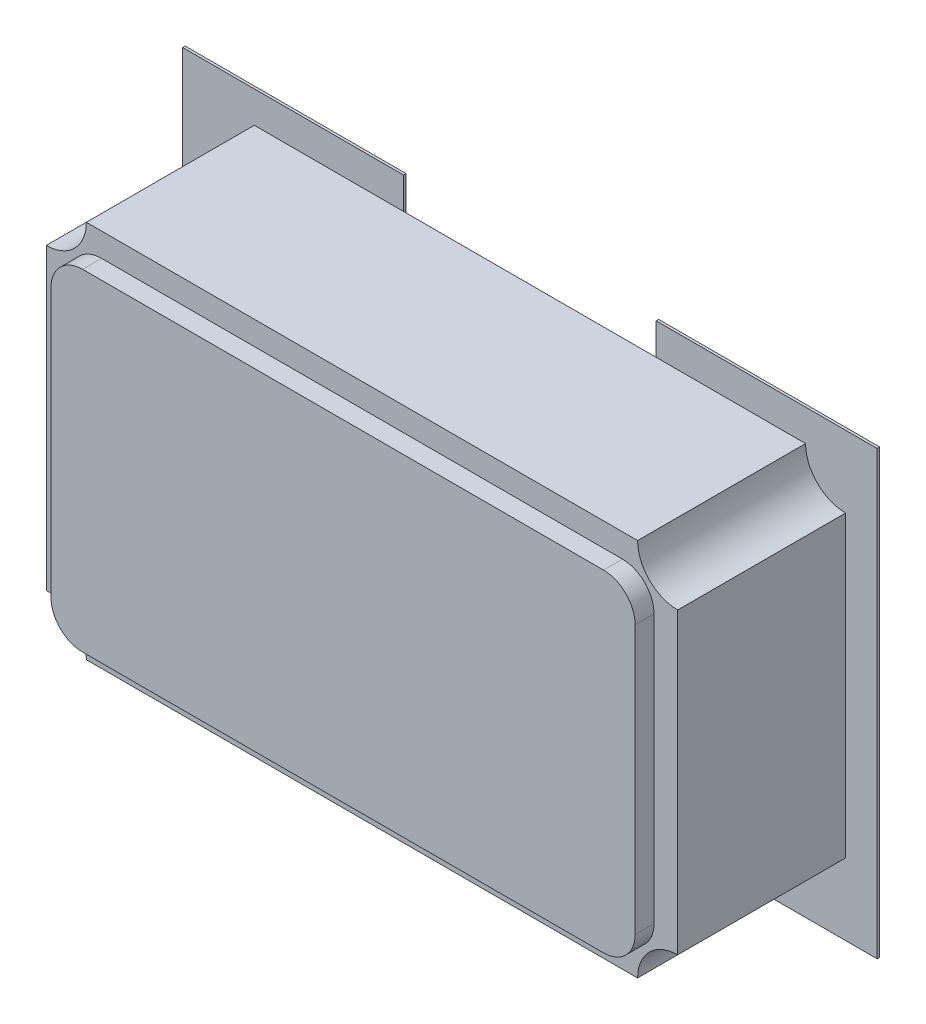
ISO-10303-21;
HEADER;
FILE_DESCRIPTION(('STEP AP214'),'2;1');
FILE_NAME('part.step','',(''),(''),'','','');
FILE_SCHEMA(('AUTOMOTIVE_DESIGN { 1 0 10303 214 1 1 1 1 }'));
ENDSEC;
DATA;
#1=APPLICATION_CONTEXT('core data for automotive mechanical design processes');
#2=APPLICATION_PROTOCOL_DEFINITION('international standard','automotive_design',2000,#1);
#3=PRODUCT_CONTEXT('',#1,'mechanical');
#4=PRODUCT('Part','Part','',(#3));
#5=PRODUCT_RELATED_PRODUCT_CATEGORY('part','',(#4));
#6=PRODUCT_DEFINITION_FORMATION('','',#4);
#7=PRODUCT_DEFINITION_CONTEXT('part definition',#1,'design');
#8=PRODUCT_DEFINITION('design','',#6,#7);
#9=PRODUCT_DEFINITION_SHAPE('','',#8);
#10=(LENGTH_UNIT() NAMED_UNIT(*) SI_UNIT(.MILLI.,.METRE.));
#11=(NAMED_UNIT(*) PLANE_ANGLE_UNIT() SI_UNIT($,.RADIAN.));
#12=(NAMED_UNIT(*) SI_UNIT($,.STERADIAN.) SOLID_ANGLE_UNIT());
#13=UNCERTAINTY_MEASURE_WITH_UNIT(LENGTH_MEASURE(1.E-05),#10,'distance_accuracy_value','');
#14=(GEOMETRIC_REPRESENTATION_CONTEXT(3) GLOBAL_UNCERTAINTY_ASSIGNED_CONTEXT((#13)) GLOBAL_UNIT_ASSIGNED_CONTEXT((#10,
#11,#12)) REPRESENTATION_CONTEXT('',''));
#15=CARTESIAN_POINT('',(0.,0.,0.));
#16=DIRECTION('',(0.,0.,1.));
#17=DIRECTION('',(1.,0.,0.));
#18=AXIS2_PLACEMENT_3D('',#15,#16,#17);
#19=CARTESIAN_POINT('',(0.,0.,0.0762));
#20=DIRECTION('',(0.,0.,1.));
#21=DIRECTION('',(1.,0.,0.));
#22=AXIS2_PLACEMENT_3D('',#19,#20,#21);
#23=PLANE('',#22);
#24=DIRECTION('',(0.,1.,0.));
#25=VECTOR('',#24,1.);
#26=CARTESIAN_POINT('',(1.09999999999992,0.699999999999994,0.0762));
#27=LINE('',#26,#25);
#28=CARTESIAN_POINT('',(1.09999999999992,-0.699999999999994,0.0762));
#29=VERTEX_POINT('',#28);
#30=CARTESIAN_POINT('',(1.09999999999992,0.699999999999994,0.0762));
#31=VERTEX_POINT('',#30);
#32=EDGE_CURVE('E172',#29,#31,#27,.T.);
#33=ORIENTED_EDGE('',*,*,#32,.F.);
#34=DIRECTION('',(1.,0.,0.));
#35=VECTOR('',#34,1.);
#36=CARTESIAN_POINT('',(1.09999999999992,-0.699999999999994,0.0762));
#37=LINE('',#36,#35);
#38=CARTESIAN_POINT('',(0.399999999999924,-0.699999999999994,0.0762));
#39=VERTEX_POINT('',#38);
#40=EDGE_CURVE('E194',#39,#29,#37,.T.);
#41=ORIENTED_EDGE('',*,*,#40,.F.);
#42=DIRECTION('',(0.,1.,0.));
#43=VECTOR('',#42,1.);
#44=CARTESIAN_POINT('',(0.399999999999924,-0.699999999999994,0.0762));
#45=LINE('',#44,#43);
#46=CARTESIAN_POINT('',(0.399999999999924,0.699999999999994,0.0762));
#47=VERTEX_POINT('',#46);
#48=EDGE_CURVE('E175',#47,#39,#45,.F.);
#49=ORIENTED_EDGE('',*,*,#48,.F.);
#50=DIRECTION('',(1.,0.,0.));
#51=VECTOR('',#50,1.);
#52=CARTESIAN_POINT('',(0.399999999999924,0.699999999999994,0.0762));
#53=LINE('',#52,#51);
#54=EDGE_CURVE('E169',#31,#47,#53,.F.);
#55=ORIENTED_EDGE('',*,*,#54,.F.);
#56=EDGE_LOOP('',(#33,#41,#49,#55));
#57=FACE_BOUND('',#56,.T.);
#58=ADVANCED_FACE('F17',(#57),#23,.F.);
#59=CARTESIAN_POINT('',(0.,0.,0.0762));
#60=DIRECTION('',(0.,0.,1.));
#61=DIRECTION('',(1.,0.,0.));
#62=AXIS2_PLACEMENT_3D('',#59,#60,#61);
#63=PLANE('',#62);
#64=DIRECTION('',(0.,1.,0.));
#65=VECTOR('',#64,1.);
#66=CARTESIAN_POINT('',(-1.09999999999992,-0.699999999999994,0.0762));
#67=LINE('',#66,#65);
#68=CARTESIAN_POINT('',(-1.09999999999992,0.699999999999994,0.0762));
#69=VERTEX_POINT('',#68);
#70=CARTESIAN_POINT('',(-1.09999999999992,-0.699999999999994,0.0762));
#71=VERTEX_POINT('',#70);
#72=EDGE_CURVE('E331',#69,#71,#67,.F.);
#73=ORIENTED_EDGE('',*,*,#72,.F.);
#74=DIRECTION('',(1.,0.,0.));
#75=VECTOR('',#74,1.);
#76=CARTESIAN_POINT('',(0.,0.699999999999994,0.0762));
#77=LINE('',#76,#75);
#78=CARTESIAN_POINT('',(-0.399999999999924,0.699999999999994,0.0762));
#79=VERTEX_POINT('',#78);
#80=EDGE_CURVE('E180',#79,#69,#77,.F.);
#81=ORIENTED_EDGE('',*,*,#80,.F.);
#82=DIRECTION('',(0.,1.,0.));
#83=VECTOR('',#82,1.);
#84=CARTESIAN_POINT('',(-0.399999999999924,0.699999999999994,0.0762));
#85=LINE('',#84,#83);
#86=CARTESIAN_POINT('',(-0.399999999999924,-0.699999999999994,0.0762));
#87=VERTEX_POINT('',#86);
#88=EDGE_CURVE('E341',#87,#79,#85,.T.);
#89=ORIENTED_EDGE('',*,*,#88,.F.);
#90=DIRECTION('',(1.,0.,0.));
#91=VECTOR('',#90,1.);
#92=CARTESIAN_POINT('',(-0.399999999999924,-0.699999999999994,0.0762));
#93=LINE('',#92,#91);
#94=EDGE_CURVE('E337',#71,#87,#93,.T.);
#95=ORIENTED_EDGE('',*,*,#94,.F.);
#96=EDGE_LOOP('',(#73,#81,#89,#95));
#97=FACE_BOUND('',#96,.T.);
#98=ADVANCED_FACE('F761',(#97),#63,.F.);
#99=CARTESIAN_POINT('',(0.399999999999924,0.699999999999994,0.0762));
#100=DIRECTION('',(0.,1.,0.));
#101=DIRECTION('',(0.,0.,1.));
#102=AXIS2_PLACEMENT_3D('',#99,#100,#101);
#103=PLANE('',#102);
#104=DIRECTION('',(0.,0.,-1.));
#105=VECTOR('',#104,1.);
#106=CARTESIAN_POINT('',(1.09999999999992,0.699999999999994,0.0762));
#107=LINE('',#106,#105);
#108=CARTESIAN_POINT('',(1.09999999999992,0.699999999999994,0.0841999999999934));
#109=VERTEX_POINT('',#108);
#110=EDGE_CURVE('E179',#31,#109,#107,.F.);
#111=ORIENTED_EDGE('',*,*,#110,.F.);
#112=ORIENTED_EDGE('',*,*,#54,.T.);
#113=DIRECTION('',(0.,0.,1.));
#114=VECTOR('',#113,1.);
#115=CARTESIAN_POINT('',(0.399999999999924,0.699999999999994,0.0762));
#116=LINE('',#115,#114);
#117=CARTESIAN_POINT('',(0.399999999999924,0.699999999999994,0.0841999999999934));
#118=VERTEX_POINT('',#117);
#119=EDGE_CURVE('E347',#118,#47,#116,.F.);
#120=ORIENTED_EDGE('',*,*,#119,.F.);
#121=DIRECTION('',(-1.,0.,0.));
#122=VECTOR('',#121,1.);
#123=CARTESIAN_POINT('',(0.,0.699999999999994,0.0841999999999934));
#124=LINE('',#123,#122);
#125=EDGE_CURVE('E185',#118,#109,#124,.F.);
#126=ORIENTED_EDGE('',*,*,#125,.T.);
#127=EDGE_LOOP('',(#111,#112,#120,#126));
#128=FACE_BOUND('',#127,.T.);
#129=ADVANCED_FACE('F183',(#128),#103,.T.);
#130=CARTESIAN_POINT('',(1.09999999999992,0.699999999999994,0.0762));
#131=DIRECTION('',(1.,0.,0.));
#132=DIRECTION('',(0.,0.,-1.));
#133=AXIS2_PLACEMENT_3D('',#130,#131,#132);
#134=PLANE('',#133);
#135=DIRECTION('',(0.,0.,-1.));
#136=VECTOR('',#135,1.);
#137=CARTESIAN_POINT('',(1.09999999999992,-0.699999999999994,0.0762));
#138=LINE('',#137,#136);
#139=CARTESIAN_POINT('',(1.09999999999992,-0.699999999999994,0.0841999999999934));
#140=VERTEX_POINT('',#139);
#141=EDGE_CURVE('E191',#29,#140,#138,.F.);
#142=ORIENTED_EDGE('',*,*,#141,.F.);
#143=ORIENTED_EDGE('',*,*,#32,.T.);
#144=ORIENTED_EDGE('',*,*,#110,.T.);
#145=DIRECTION('',(0.,1.,0.));
#146=VECTOR('',#145,1.);
#147=CARTESIAN_POINT('',(1.09999999999992,0.,0.0841999999999934));
#148=LINE('',#147,#146);
#149=EDGE_CURVE('E360',#109,#140,#148,.F.);
#150=ORIENTED_EDGE('',*,*,#149,.T.);
#151=EDGE_LOOP('',(#142,#143,#144,#150));
#152=FACE_BOUND('',#151,.T.);
#153=ADVANCED_FACE('F189',(#152),#134,.T.);
#154=CARTESIAN_POINT('',(1.09999999999992,-0.699999999999994,0.0762));
#155=DIRECTION('',(0.,-1.,0.));
#156=DIRECTION('',(0.,0.,-1.));
#157=AXIS2_PLACEMENT_3D('',#154,#155,#156);
#158=PLANE('',#157);
#159=DIRECTION('',(0.,0.,1.));
#160=VECTOR('',#159,1.);
#161=CARTESIAN_POINT('',(0.399999999999924,-0.699999999999994,0.0762));
#162=LINE('',#161,#160);
#163=CARTESIAN_POINT('',(0.399999999999924,-0.699999999999994,0.0841999999999934));
#164=VERTEX_POINT('',#163);
#165=EDGE_CURVE('E353',#39,#164,#162,.T.);
#166=ORIENTED_EDGE('',*,*,#165,.F.);
#167=ORIENTED_EDGE('',*,*,#40,.T.);
#168=ORIENTED_EDGE('',*,*,#141,.T.);
#169=DIRECTION('',(-1.,0.,0.));
#170=VECTOR('',#169,1.);
#171=CARTESIAN_POINT('',(0.,-0.699999999999994,0.0841999999999934));
#172=LINE('',#171,#170);
#173=EDGE_CURVE('E320',#140,#164,#172,.T.);
#174=ORIENTED_EDGE('',*,*,#173,.T.);
#175=EDGE_LOOP('',(#166,#167,#168,#174));
#176=FACE_BOUND('',#175,.T.);
#177=ADVANCED_FACE('F431',(#176),#158,.T.);
#178=CARTESIAN_POINT('',(-0.399999999999924,0.699999999999994,0.0762));
#179=DIRECTION('',(1.,0.,0.));
#180=DIRECTION('',(0.,0.,-1.));
#181=AXIS2_PLACEMENT_3D('',#178,#179,#180);
#182=PLANE('',#181);
#183=DIRECTION('',(0.,1.,0.));
#184=VECTOR('',#183,1.);
#185=CARTESIAN_POINT('',(-0.399999999999924,0.,0.0841999999999934));
#186=LINE('',#185,#184);
#187=CARTESIAN_POINT('',(-0.399999999999924,-0.599999999999886,0.0841999999999934));
#188=VERTEX_POINT('',#187);
#189=CARTESIAN_POINT('',(-0.399999999999924,0.599999999999886,0.0841999999999934));
#190=VERTEX_POINT('',#189);
#191=EDGE_CURVE('E284',#188,#190,#186,.T.);
#192=ORIENTED_EDGE('',*,*,#191,.F.);
#193=DIRECTION('',(0.,1.,0.));
#194=VECTOR('',#193,1.);
#195=CARTESIAN_POINT('',(-0.399999999999924,0.699999999999994,0.0841999999999934));
#196=LINE('',#195,#194);
#197=CARTESIAN_POINT('',(-0.399999999999924,-0.699999999999994,0.0841999999999934));
#198=VERTEX_POINT('',#197);
#199=EDGE_CURVE('E344',#188,#198,#196,.F.);
#200=ORIENTED_EDGE('',*,*,#199,.T.);
#201=DIRECTION('',(0.,0.,-1.));
#202=VECTOR('',#201,1.);
#203=CARTESIAN_POINT('',(-0.399999999999924,-0.699999999999994,0.0762));
#204=LINE('',#203,#202);
#205=EDGE_CURVE('E340',#87,#198,#204,.F.);
#206=ORIENTED_EDGE('',*,*,#205,.F.);
#207=ORIENTED_EDGE('',*,*,#88,.T.);
#208=DIRECTION('',(0.,0.,1.));
#209=VECTOR('',#208,1.);
#210=CARTESIAN_POINT('',(-0.399999999999924,0.699999999999994,0.0762));
#211=LINE('',#210,#209);
#212=CARTESIAN_POINT('',(-0.399999999999924,0.699999999999994,0.0841999999999934));
#213=VERTEX_POINT('',#212);
#214=EDGE_CURVE('E330',#213,#79,#211,.F.);
#215=ORIENTED_EDGE('',*,*,#214,.F.);
#216=DIRECTION('',(0.,1.,0.));
#217=VECTOR('',#216,1.);
#218=CARTESIAN_POINT('',(-0.399999999999924,0.699999999999994,0.0841999999999934));
#219=LINE('',#218,#217);
#220=EDGE_CURVE('E141',#213,#190,#219,.F.);
#221=ORIENTED_EDGE('',*,*,#220,.T.);
#222=EDGE_LOOP('',(#192,#200,#206,#207,#215,#221));
#223=FACE_BOUND('',#222,.T.);
#224=ADVANCED_FACE('F446',(#223),#182,.T.);
#225=CARTESIAN_POINT('',(0.399999999999924,-0.699999999999994,0.0762));
#226=DIRECTION('',(-1.,0.,0.));
#227=DIRECTION('',(0.,0.,1.));
#228=AXIS2_PLACEMENT_3D('',#225,#226,#227);
#229=PLANE('',#228);
#230=DIRECTION('',(0.,1.,0.));
#231=VECTOR('',#230,1.);
#232=CARTESIAN_POINT('',(0.399999999999924,0.,0.0841999999999934));
#233=LINE('',#232,#231);
#234=CARTESIAN_POINT('',(0.399999999999924,0.599999999999886,0.0841999999999934));
#235=VERTEX_POINT('',#234);
#236=CARTESIAN_POINT('',(0.399999999999924,-0.599999999999886,0.0841999999999934));
#237=VERTEX_POINT('',#236);
#238=EDGE_CURVE('E287',#235,#237,#233,.F.);
#239=ORIENTED_EDGE('',*,*,#238,.F.);
#240=DIRECTION('',(0.,1.,0.));
#241=VECTOR('',#240,1.);
#242=CARTESIAN_POINT('',(0.399999999999924,0.,0.0841999999999934));
#243=LINE('',#242,#241);
#244=EDGE_CURVE('E301',#235,#118,#243,.T.);
#245=ORIENTED_EDGE('',*,*,#244,.T.);
#246=ORIENTED_EDGE('',*,*,#119,.T.);
#247=ORIENTED_EDGE('',*,*,#48,.T.);
#248=ORIENTED_EDGE('',*,*,#165,.T.);
#249=DIRECTION('',(0.,1.,0.));
#250=VECTOR('',#249,1.);
#251=CARTESIAN_POINT('',(0.399999999999924,0.,0.0841999999999934));
#252=LINE('',#251,#250);
#253=EDGE_CURVE('E288',#164,#237,#252,.T.);
#254=ORIENTED_EDGE('',*,*,#253,.T.);
#255=EDGE_LOOP('',(#239,#245,#246,#247,#248,#254));
#256=FACE_BOUND('',#255,.T.);
#257=ADVANCED_FACE('F421',(#256),#229,.T.);
#258=CARTESIAN_POINT('',(-0.399999999999924,-0.699999999999994,0.0762));
#259=DIRECTION('',(0.,-1.,0.));
#260=DIRECTION('',(0.,0.,-1.));
#261=AXIS2_PLACEMENT_3D('',#258,#259,#260);
#262=PLANE('',#261);
#263=DIRECTION('',(0.,0.,1.));
#264=VECTOR('',#263,1.);
#265=CARTESIAN_POINT('',(-1.09999999999992,-0.699999999999994,0.0762));
#266=LINE('',#265,#264);
#267=CARTESIAN_POINT('',(-1.09999999999992,-0.699999999999994,0.0841999999999934));
#268=VERTEX_POINT('',#267);
#269=EDGE_CURVE('E334',#71,#268,#266,.T.);
#270=ORIENTED_EDGE('',*,*,#269,.F.);
#271=ORIENTED_EDGE('',*,*,#94,.T.);
#272=ORIENTED_EDGE('',*,*,#205,.T.);
#273=DIRECTION('',(-1.,0.,0.));
#274=VECTOR('',#273,1.);
#275=CARTESIAN_POINT('',(0.,-0.699999999999994,0.0841999999999934));
#276=LINE('',#275,#274);
#277=EDGE_CURVE('E283',#198,#268,#276,.T.);
#278=ORIENTED_EDGE('',*,*,#277,.T.);
#279=EDGE_LOOP('',(#270,#271,#272,#278));
#280=FACE_BOUND('',#279,.T.);
#281=ADVANCED_FACE('F710',(#280),#262,.T.);
#282=CARTESIAN_POINT('',(-1.09999999999992,-0.699999999999994,0.0762));
#283=DIRECTION('',(-1.,0.,0.));
#284=DIRECTION('',(0.,0.,1.));
#285=AXIS2_PLACEMENT_3D('',#282,#283,#284);
#286=PLANE('',#285);
#287=DIRECTION('',(0.,0.,1.));
#288=VECTOR('',#287,1.);
#289=CARTESIAN_POINT('',(-1.09999999999992,0.699999999999994,0.0762));
#290=LINE('',#289,#288);
#291=CARTESIAN_POINT('',(-1.09999999999992,0.699999999999994,0.0841999999999934));
#292=VERTEX_POINT('',#291);
#293=EDGE_CURVE('E327',#69,#292,#290,.T.);
#294=ORIENTED_EDGE('',*,*,#293,.F.);
#295=ORIENTED_EDGE('',*,*,#72,.T.);
#296=ORIENTED_EDGE('',*,*,#269,.T.);
#297=DIRECTION('',(0.,1.,0.));
#298=VECTOR('',#297,1.);
#299=CARTESIAN_POINT('',(-1.09999999999992,0.,0.0841999999999934));
#300=LINE('',#299,#298);
#301=EDGE_CURVE('E271',#268,#292,#300,.T.);
#302=ORIENTED_EDGE('',*,*,#301,.T.);
#303=EDGE_LOOP('',(#294,#295,#296,#302));
#304=FACE_BOUND('',#303,.T.);
#305=ADVANCED_FACE('F701',(#304),#286,.T.);
#306=CARTESIAN_POINT('',(-1.09999999999992,0.699999999999994,0.0762));
#307=DIRECTION('',(0.,1.,0.));
#308=DIRECTION('',(0.,0.,1.));
#309=AXIS2_PLACEMENT_3D('',#306,#307,#308);
#310=PLANE('',#309);
#311=ORIENTED_EDGE('',*,*,#214,.T.);
#312=ORIENTED_EDGE('',*,*,#80,.T.);
#313=ORIENTED_EDGE('',*,*,#293,.T.);
#314=DIRECTION('',(-1.,0.,0.));
#315=VECTOR('',#314,1.);
#316=CARTESIAN_POINT('',(0.,0.699999999999994,0.0841999999999934));
#317=LINE('',#316,#315);
#318=EDGE_CURVE('E265',#292,#213,#317,.F.);
#319=ORIENTED_EDGE('',*,*,#318,.T.);
#320=EDGE_LOOP('',(#311,#312,#313,#319));
#321=FACE_BOUND('',#320,.T.);
#322=ADVANCED_FACE('F693',(#321),#310,.T.);
#323=CARTESIAN_POINT('',(0.,0.,0.0841999999999934));
#324=DIRECTION('',(0.,0.,-1.));
#325=DIRECTION('',(-1.,0.,0.));
#326=AXIS2_PLACEMENT_3D('',#323,#324,#325);
#327=PLANE('',#326);
#328=ORIENTED_EDGE('',*,*,#173,.F.);
#329=ORIENTED_EDGE('',*,*,#149,.F.);
#330=ORIENTED_EDGE('',*,*,#125,.F.);
#331=ORIENTED_EDGE('',*,*,#244,.F.);
#332=DIRECTION('',(-1.,0.,0.));
#333=VECTOR('',#332,1.);
#334=CARTESIAN_POINT('',(0.,0.599999999999886,0.0841999999999934));
#335=LINE('',#334,#333);
#336=CARTESIAN_POINT('',(0.873000000000064,0.599999999999886,0.0841999999999934));
#337=VERTEX_POINT('',#336);
#338=EDGE_CURVE('E298',#337,#235,#335,.T.);
#339=ORIENTED_EDGE('',*,*,#338,.F.);
#340=CARTESIAN_POINT('',(1.00000000000006,0.599999999999886,0.0841999999999934));
#341=DIRECTION('',(0.,0.,1.));
#342=DIRECTION('',(1.,0.,0.));
#343=AXIS2_PLACEMENT_3D('',#340,#341,#342);
#344=CIRCLE('',#343,0.127);
#345=CARTESIAN_POINT('',(1.00000000000006,0.472999999999886,0.0841999999999934));
#346=VERTEX_POINT('',#345);
#347=EDGE_CURVE('E20',#346,#337,#344,.F.);
#348=ORIENTED_EDGE('',*,*,#347,.F.);
#349=DIRECTION('',(0.,1.,0.));
#350=VECTOR('',#349,1.);
#351=CARTESIAN_POINT('',(1.00000000000006,-0.472999999999886,0.0841999999999934));
#352=LINE('',#351,#350);
#353=CARTESIAN_POINT('',(1.00000000000006,-0.472999999999886,0.0841999999999934));
#354=VERTEX_POINT('',#353);
#355=EDGE_CURVE('E295',#354,#346,#352,.T.);
#356=ORIENTED_EDGE('',*,*,#355,.F.);
#357=CARTESIAN_POINT('',(1.00000000000006,-0.599999999999886,0.0841999999999934));
#358=DIRECTION('',(0.,0.,1.));
#359=DIRECTION('',(1.,0.,0.));
#360=AXIS2_PLACEMENT_3D('',#357,#358,#359);
#361=CIRCLE('',#360,0.127);
#362=CARTESIAN_POINT('',(0.873000000000064,-0.599999999999886,0.0841999999999934));
#363=VERTEX_POINT('',#362);
#364=EDGE_CURVE('E254',#354,#363,#361,.T.);
#365=ORIENTED_EDGE('',*,*,#364,.T.);
#366=DIRECTION('',(1.,0.,0.));
#367=VECTOR('',#366,1.);
#368=CARTESIAN_POINT('',(-0.873000000000064,-0.599999999999886,0.0841999999999934));
#369=LINE('',#368,#367);
#370=EDGE_CURVE('E263',#237,#363,#369,.T.);
#371=ORIENTED_EDGE('',*,*,#370,.F.);
#372=ORIENTED_EDGE('',*,*,#253,.F.);
#373=EDGE_LOOP('',(#328,#329,#330,#331,#339,#348,#356,#365,#371,#372));
#374=FACE_BOUND('',#373,.T.);
#375=ADVANCED_FACE('F417',(#374),#327,.F.);
#376=CARTESIAN_POINT('',(0.,0.,0.0841999999999934));
#377=DIRECTION('',(0.,0.,-1.));
#378=DIRECTION('',(-1.,0.,0.));
#379=AXIS2_PLACEMENT_3D('',#376,#377,#378);
#380=PLANE('',#379);
#381=ORIENTED_EDGE('',*,*,#238,.T.);
#382=DIRECTION('',(1.,0.,0.));
#383=VECTOR('',#382,1.);
#384=CARTESIAN_POINT('',(-0.873000000000064,-0.599999999999886,0.0841999999999934));
#385=LINE('',#384,#383);
#386=EDGE_CURVE('E256',#188,#237,#385,.T.);
#387=ORIENTED_EDGE('',*,*,#386,.F.);
#388=ORIENTED_EDGE('',*,*,#191,.T.);
#389=DIRECTION('',(1.,0.,0.));
#390=VECTOR('',#389,1.);
#391=CARTESIAN_POINT('',(0.873000000000064,0.599999999999886,0.0841999999999934));
#392=LINE('',#391,#390);
#393=EDGE_CURVE('E253',#235,#190,#392,.F.);
#394=ORIENTED_EDGE('',*,*,#393,.F.);
#395=EDGE_LOOP('',(#381,#387,#388,#394));
#396=FACE_BOUND('',#395,.T.);
#397=ADVANCED_FACE('F439',(#396),#380,.T.);
#398=CARTESIAN_POINT('',(0.,0.,0.0841999999999934));
#399=DIRECTION('',(0.,0.,-1.));
#400=DIRECTION('',(-1.,0.,0.));
#401=AXIS2_PLACEMENT_3D('',#398,#399,#400);
#402=PLANE('',#401);
#403=DIRECTION('',(0.,1.,0.));
#404=VECTOR('',#403,1.);
#405=CARTESIAN_POINT('',(-1.00000000000006,0.472999999999886,0.0841999999999934));
#406=LINE('',#405,#404);
#407=CARTESIAN_POINT('',(-1.00000000000006,0.472999999999886,0.0841999999999934));
#408=VERTEX_POINT('',#407);
#409=CARTESIAN_POINT('',(-1.00000000000006,-0.472999999999886,0.0841999999999934));
#410=VERTEX_POINT('',#409);
#411=EDGE_CURVE('E259',#408,#410,#406,.F.);
#412=ORIENTED_EDGE('',*,*,#411,.F.);
#413=CARTESIAN_POINT('',(-1.00000000000006,0.599999999999886,0.0841999999999934));
#414=DIRECTION('',(0.,0.,1.));
#415=DIRECTION('',(1.,0.,0.));
#416=AXIS2_PLACEMENT_3D('',#413,#414,#415);
#417=CIRCLE('',#416,0.127);
#418=CARTESIAN_POINT('',(-0.873000000000064,0.599999999999886,0.0841999999999934));
#419=VERTEX_POINT('',#418);
#420=EDGE_CURVE('E250',#408,#419,#417,.T.);
#421=ORIENTED_EDGE('',*,*,#420,.T.);
#422=DIRECTION('',(1.,0.,0.));
#423=VECTOR('',#422,1.);
#424=CARTESIAN_POINT('',(0.873000000000064,0.599999999999886,0.0841999999999934));
#425=LINE('',#424,#423);
#426=EDGE_CURVE('E274',#190,#419,#425,.F.);
#427=ORIENTED_EDGE('',*,*,#426,.F.);
#428=ORIENTED_EDGE('',*,*,#220,.F.);
#429=ORIENTED_EDGE('',*,*,#318,.F.);
#430=ORIENTED_EDGE('',*,*,#301,.F.);
#431=ORIENTED_EDGE('',*,*,#277,.F.);
#432=ORIENTED_EDGE('',*,*,#199,.F.);
#433=DIRECTION('',(1.,0.,0.));
#434=VECTOR('',#433,1.);
#435=CARTESIAN_POINT('',(-0.873000000000064,-0.599999999999886,0.0841999999999934));
#436=LINE('',#435,#434);
#437=CARTESIAN_POINT('',(-0.873000000000064,-0.599999999999886,0.0841999999999934));
#438=VERTEX_POINT('',#437);
#439=EDGE_CURVE('E309',#438,#188,#436,.T.);
#440=ORIENTED_EDGE('',*,*,#439,.F.);
#441=CARTESIAN_POINT('',(-1.00000000000006,-0.599999999999886,0.0841999999999934));
#442=DIRECTION('',(0.,0.,1.));
#443=DIRECTION('',(1.,0.,0.));
#444=AXIS2_PLACEMENT_3D('',#441,#442,#443);
#445=CIRCLE('',#444,0.127);
#446=EDGE_CURVE('E257',#438,#410,#445,.T.);
#447=ORIENTED_EDGE('',*,*,#446,.T.);
#448=EDGE_LOOP('',(#412,#421,#427,#428,#429,#430,#431,#432,#440,#447));
#449=FACE_BOUND('',#448,.T.);
#450=ADVANCED_FACE('F443',(#449),#402,.F.);
#451=CARTESIAN_POINT('',(-1.00000000000006,0.472999999999886,0.0762));
#452=DIRECTION('',(-1.,0.,0.));
#453=DIRECTION('',(0.,0.,1.));
#454=AXIS2_PLACEMENT_3D('',#451,#452,#453);
#455=PLANE('',#454);
#456=DIRECTION('',(0.,0.,1.));
#457=VECTOR('',#456,1.);
#458=CARTESIAN_POINT('',(-1.00000000000006,0.472999999999886,0.0762));
#459=LINE('',#458,#457);
#460=CARTESIAN_POINT('',(-1.00000000000006,0.472999999999886,0.61614800000024));
#461=VERTEX_POINT('',#460);
#462=EDGE_CURVE('E453',#461,#408,#459,.F.);
#463=ORIENTED_EDGE('',*,*,#462,.T.);
#464=ORIENTED_EDGE('',*,*,#411,.T.);
#465=DIRECTION('',(0.,0.,1.));
#466=VECTOR('',#465,1.);
#467=CARTESIAN_POINT('',(-1.00000000000006,-0.472999999999886,0.0762));
#468=LINE('',#467,#466);
#469=CARTESIAN_POINT('',(-1.00000000000006,-0.472999999999886,0.61614800000024));
#470=VERTEX_POINT('',#469);
#471=EDGE_CURVE('E258',#410,#470,#468,.T.);
#472=ORIENTED_EDGE('',*,*,#471,.T.);
#473=DIRECTION('',(0.,1.,0.));
#474=VECTOR('',#473,1.);
#475=CARTESIAN_POINT('',(-1.00000000000006,0.,0.61614800000024));
#476=LINE('',#475,#474);
#477=EDGE_CURVE('E249',#461,#470,#476,.F.);
#478=ORIENTED_EDGE('',*,*,#477,.F.);
#479=EDGE_LOOP('',(#463,#464,#472,#478));
#480=FACE_BOUND('',#479,.T.);
#481=ADVANCED_FACE('F661',(#480),#455,.T.);
#482=CARTESIAN_POINT('',(-1.00000000000006,-0.599999999999886,0.0762));
#483=DIRECTION('',(0.,0.,1.));
#484=DIRECTION('',(1.,0.,0.));
#485=AXIS2_PLACEMENT_3D('',#482,#483,#484);
#486=CYLINDRICAL_SURFACE('',#485,0.127);
#487=CARTESIAN_POINT('',(-1.00000000000006,-0.599999999999886,0.61614800000024));
#488=DIRECTION('',(0.,0.,1.));
#489=DIRECTION('',(1.,0.,0.));
#490=AXIS2_PLACEMENT_3D('',#487,#488,#489);
#491=CIRCLE('',#490,0.127);
#492=CARTESIAN_POINT('',(-0.873000000000064,-0.599999999999886,0.61614800000024));
#493=VERTEX_POINT('',#492);
#494=EDGE_CURVE('E246',#470,#493,#491,.F.);
#495=ORIENTED_EDGE('',*,*,#494,.F.);
#496=ORIENTED_EDGE('',*,*,#471,.F.);
#497=ORIENTED_EDGE('',*,*,#446,.F.);
#498=DIRECTION('',(0.,0.,-1.));
#499=VECTOR('',#498,1.);
#500=CARTESIAN_POINT('',(-0.873000000000064,-0.599999999999886,0.0762));
#501=LINE('',#500,#499);
#502=EDGE_CURVE('E306',#493,#438,#501,.T.);
#503=ORIENTED_EDGE('',*,*,#502,.F.);
#504=EDGE_LOOP('',(#495,#496,#497,#503));
#505=FACE_BOUND('',#504,.T.);
#506=ADVANCED_FACE('F653',(#505),#486,.F.);
#507=CARTESIAN_POINT('',(-0.873000000000064,-0.599999999999886,0.0762));
#508=DIRECTION('',(0.,-1.,0.));
#509=DIRECTION('',(0.,0.,-1.));
#510=AXIS2_PLACEMENT_3D('',#507,#508,#509);
#511=PLANE('',#510);
#512=ORIENTED_EDGE('',*,*,#439,.T.);
#513=ORIENTED_EDGE('',*,*,#386,.T.);
#514=ORIENTED_EDGE('',*,*,#370,.T.);
#515=DIRECTION('',(0.,0.,1.));
#516=VECTOR('',#515,1.);
#517=CARTESIAN_POINT('',(0.873000000000064,-0.599999999999886,0.0762));
#518=LINE('',#517,#516);
#519=CARTESIAN_POINT('',(0.873000000000064,-0.599999999999886,0.61614800000024));
#520=VERTEX_POINT('',#519);
#521=EDGE_CURVE('E255',#363,#520,#518,.T.);
#522=ORIENTED_EDGE('',*,*,#521,.T.);
#523=DIRECTION('',(1.,0.,0.));
#524=VECTOR('',#523,1.);
#525=CARTESIAN_POINT('',(0.,-0.599999999999886,0.61614800000024));
#526=LINE('',#525,#524);
#527=EDGE_CURVE('E245',#493,#520,#526,.T.);
#528=ORIENTED_EDGE('',*,*,#527,.F.);
#529=ORIENTED_EDGE('',*,*,#502,.T.);
#530=EDGE_LOOP('',(#512,#513,#514,#522,#528,#529));
#531=FACE_BOUND('',#530,.T.);
#532=ADVANCED_FACE('F440',(#531),#511,.T.);
#533=CARTESIAN_POINT('',(1.00000000000006,-0.599999999999886,0.0762));
#534=DIRECTION('',(0.,0.,1.));
#535=DIRECTION('',(1.,0.,0.));
#536=AXIS2_PLACEMENT_3D('',#533,#534,#535);
#537=CYLINDRICAL_SURFACE('',#536,0.127);
#538=CARTESIAN_POINT('',(1.00000000000006,-0.599999999999886,0.61614800000024));
#539=DIRECTION('',(0.,0.,1.));
#540=DIRECTION('',(1.,0.,0.));
#541=AXIS2_PLACEMENT_3D('',#538,#539,#540);
#542=CIRCLE('',#541,0.127);
#543=CARTESIAN_POINT('',(1.00000000000006,-0.472999999999886,0.61614800000024));
#544=VERTEX_POINT('',#543);
#545=EDGE_CURVE('E242',#520,#544,#542,.F.);
#546=ORIENTED_EDGE('',*,*,#545,.F.);
#547=ORIENTED_EDGE('',*,*,#521,.F.);
#548=ORIENTED_EDGE('',*,*,#364,.F.);
#549=DIRECTION('',(0.,0.,-1.));
#550=VECTOR('',#549,1.);
#551=CARTESIAN_POINT('',(1.00000000000006,-0.472999999999886,0.0762));
#552=LINE('',#551,#550);
#553=EDGE_CURVE('E297',#544,#354,#552,.T.);
#554=ORIENTED_EDGE('',*,*,#553,.F.);
#555=EDGE_LOOP('',(#546,#547,#548,#554));
#556=FACE_BOUND('',#555,.T.);
#557=ADVANCED_FACE('F465',(#556),#537,.F.);
#558=CARTESIAN_POINT('',(1.00000000000006,-0.472999999999886,0.0762));
#559=DIRECTION('',(1.,0.,0.));
#560=DIRECTION('',(0.,0.,-1.));
#561=AXIS2_PLACEMENT_3D('',#558,#559,#560);
#562=PLANE('',#561);
#563=ORIENTED_EDGE('',*,*,#553,.T.);
#564=ORIENTED_EDGE('',*,*,#355,.T.);
#565=DIRECTION('',(0.,0.,1.));
#566=VECTOR('',#565,1.);
#567=CARTESIAN_POINT('',(1.00000000000006,0.472999999999886,0.0762));
#568=LINE('',#567,#566);
#569=CARTESIAN_POINT('',(1.00000000000006,0.472999999999886,0.61614800000024));
#570=VERTEX_POINT('',#569);
#571=EDGE_CURVE('E278',#346,#570,#568,.T.);
#572=ORIENTED_EDGE('',*,*,#571,.T.);
#573=DIRECTION('',(0.,1.,0.));
#574=VECTOR('',#573,1.);
#575=CARTESIAN_POINT('',(1.00000000000006,0.,0.61614800000024));
#576=LINE('',#575,#574);
#577=EDGE_CURVE('E241',#544,#570,#576,.T.);
#578=ORIENTED_EDGE('',*,*,#577,.F.);
#579=EDGE_LOOP('',(#563,#564,#572,#578));
#580=FACE_BOUND('',#579,.T.);
#581=ADVANCED_FACE('F497',(#580),#562,.T.);
#582=CARTESIAN_POINT('',(1.00000000000006,0.599999999999886,0.0762));
#583=DIRECTION('',(0.,0.,1.));
#584=DIRECTION('',(1.,0.,0.));
#585=AXIS2_PLACEMENT_3D('',#582,#583,#584);
#586=CYLINDRICAL_SURFACE('',#585,0.127);
#587=CARTESIAN_POINT('',(1.00000000000006,0.599999999999886,0.61614800000024));
#588=DIRECTION('',(0.,0.,1.));
#589=DIRECTION('',(1.,0.,0.));
#590=AXIS2_PLACEMENT_3D('',#587,#588,#589);
#591=CIRCLE('',#590,0.127);
#592=CARTESIAN_POINT('',(0.873000000000064,0.599999999999886,0.61614800000024));
#593=VERTEX_POINT('',#592);
#594=EDGE_CURVE('E238',#570,#593,#591,.F.);
#595=ORIENTED_EDGE('',*,*,#594,.F.);
#596=ORIENTED_EDGE('',*,*,#571,.F.);
#597=ORIENTED_EDGE('',*,*,#347,.T.);
#598=DIRECTION('',(0.,0.,1.));
#599=VECTOR('',#598,1.);
#600=CARTESIAN_POINT('',(0.873000000000064,0.599999999999886,0.0762));
#601=LINE('',#600,#599);
#602=EDGE_CURVE('E277',#593,#337,#601,.F.);
#603=ORIENTED_EDGE('',*,*,#602,.F.);
#604=EDGE_LOOP('',(#595,#596,#597,#603));
#605=FACE_BOUND('',#604,.T.);
#606=ADVANCED_FACE('F407',(#605),#586,.F.);
#607=CARTESIAN_POINT('',(0.873000000000064,0.599999999999886,0.0762));
#608=DIRECTION('',(0.,1.,0.));
#609=DIRECTION('',(0.,0.,1.));
#610=AXIS2_PLACEMENT_3D('',#607,#608,#609);
#611=PLANE('',#610);
#612=ORIENTED_EDGE('',*,*,#338,.T.);
#613=ORIENTED_EDGE('',*,*,#393,.T.);
#614=ORIENTED_EDGE('',*,*,#426,.T.);
#615=DIRECTION('',(0.,0.,1.));
#616=VECTOR('',#615,1.);
#617=CARTESIAN_POINT('',(-0.873000000000064,0.599999999999886,0.0762));
#618=LINE('',#617,#616);
#619=CARTESIAN_POINT('',(-0.873000000000064,0.599999999999886,0.61614800000024));
#620=VERTEX_POINT('',#619);
#621=EDGE_CURVE('E252',#419,#620,#618,.T.);
#622=ORIENTED_EDGE('',*,*,#621,.T.);
#623=DIRECTION('',(1.,0.,0.));
#624=VECTOR('',#623,1.);
#625=CARTESIAN_POINT('',(0.,0.599999999999886,0.61614800000024));
#626=LINE('',#625,#624);
#627=EDGE_CURVE('E237',#593,#620,#626,.F.);
#628=ORIENTED_EDGE('',*,*,#627,.F.);
#629=ORIENTED_EDGE('',*,*,#602,.T.);
#630=EDGE_LOOP('',(#612,#613,#614,#622,#628,#629));
#631=FACE_BOUND('',#630,.T.);
#632=ADVANCED_FACE('F411',(#631),#611,.T.);
#633=CARTESIAN_POINT('',(-1.00000000000006,0.599999999999886,0.0762));
#634=DIRECTION('',(0.,0.,1.));
#635=DIRECTION('',(1.,0.,0.));
#636=AXIS2_PLACEMENT_3D('',#633,#634,#635);
#637=CYLINDRICAL_SURFACE('',#636,0.127);
#638=CARTESIAN_POINT('',(-1.00000000000006,0.599999999999886,0.61614800000024));
#639=DIRECTION('',(0.,0.,1.));
#640=DIRECTION('',(1.,0.,0.));
#641=AXIS2_PLACEMENT_3D('',#638,#639,#640);
#642=CIRCLE('',#641,0.127);
#643=EDGE_CURVE('E234',#620,#461,#642,.F.);
#644=ORIENTED_EDGE('',*,*,#643,.F.);
#645=ORIENTED_EDGE('',*,*,#621,.F.);
#646=ORIENTED_EDGE('',*,*,#420,.F.);
#647=ORIENTED_EDGE('',*,*,#462,.F.);
#648=EDGE_LOOP('',(#644,#645,#646,#647));
#649=FACE_BOUND('',#648,.T.);
#650=ADVANCED_FACE('F451',(#649),#637,.F.);
#651=CARTESIAN_POINT('',(0.,0.,0.61614800000024));
#652=DIRECTION('',(0.,0.,1.));
#653=DIRECTION('',(1.,0.,0.));
#654=AXIS2_PLACEMENT_3D('',#651,#652,#653);
#655=PLANE('',#654);
#656=CARTESIAN_POINT('',(-0.825000000000002,0.425000000000078,0.61614800000024));
#657=DIRECTION('',(0.,0.,1.));
#658=DIRECTION('',(1.,0.,0.));
#659=AXIS2_PLACEMENT_3D('',#656,#657,#658);
#660=CIRCLE('',#659,0.100000000000006);
#661=CARTESIAN_POINT('',(-0.825000000000002,0.524999999999932,0.61614800000024));
#662=VERTEX_POINT('',#661);
#663=CARTESIAN_POINT('',(-0.92500000000011,0.425000000000078,0.61614800000024));
#664=VERTEX_POINT('',#663);
#665=EDGE_CURVE('E230',#662,#664,#660,.T.);
#666=ORIENTED_EDGE('',*,*,#665,.F.);
#667=DIRECTION('',(1.,0.,0.));
#668=VECTOR('',#667,1.);
#669=CARTESIAN_POINT('',(-0.825000000000002,0.524999999999932,0.61614800000024));
#670=LINE('',#669,#668);
#671=CARTESIAN_POINT('',(0.825000000000002,0.524999999999932,0.61614800000024));
#672=VERTEX_POINT('',#671);
#673=EDGE_CURVE('E495',#662,#672,#670,.T.);
#674=ORIENTED_EDGE('',*,*,#673,.T.);
#675=CARTESIAN_POINT('',(0.825000000000002,0.425000000000078,0.61614800000024));
#676=DIRECTION('',(0.,0.,1.));
#677=DIRECTION('',(1.,0.,0.));
#678=AXIS2_PLACEMENT_3D('',#675,#676,#677);
#679=CIRCLE('',#678,0.100000000000006);
#680=CARTESIAN_POINT('',(0.925000000000059,0.425000000000078,0.61614800000024));
#681=VERTEX_POINT('',#680);
#682=EDGE_CURVE('E216',#681,#672,#679,.T.);
#683=ORIENTED_EDGE('',*,*,#682,.F.);
#684=DIRECTION('',(0.,1.,0.));
#685=VECTOR('',#684,1.);
#686=CARTESIAN_POINT('',(0.92500000000011,0.425000000000078,0.61614800000024));
#687=LINE('',#686,#685);
#688=CARTESIAN_POINT('',(0.92500000000011,-0.425000000000078,0.61614800000024));
#689=VERTEX_POINT('',#688);
#690=EDGE_CURVE('E223',#681,#689,#687,.F.);
#691=ORIENTED_EDGE('',*,*,#690,.T.);
#692=CARTESIAN_POINT('',(0.825000000000002,-0.425000000000078,0.61614800000024));
#693=DIRECTION('',(0.,0.,1.));
#694=DIRECTION('',(1.,0.,0.));
#695=AXIS2_PLACEMENT_3D('',#692,#693,#694);
#696=CIRCLE('',#695,0.100000000000006);
#697=CARTESIAN_POINT('',(0.825000000000002,-0.525000000000008,0.61614800000024));
#698=VERTEX_POINT('',#697);
#699=EDGE_CURVE('E220',#698,#689,#696,.T.);
#700=ORIENTED_EDGE('',*,*,#699,.F.);
#701=DIRECTION('',(1.,0.,0.));
#702=VECTOR('',#701,1.);
#703=CARTESIAN_POINT('',(0.825000000000002,-0.524999999999932,0.61614800000024));
#704=LINE('',#703,#702);
#705=CARTESIAN_POINT('',(-0.825000000000002,-0.524999999999932,0.61614800000024));
#706=VERTEX_POINT('',#705);
#707=EDGE_CURVE('E228',#698,#706,#704,.F.);
#708=ORIENTED_EDGE('',*,*,#707,.T.);
#709=CARTESIAN_POINT('',(-0.825000000000002,-0.425000000000078,0.61614800000024));
#710=DIRECTION('',(0.,0.,1.));
#711=DIRECTION('',(1.,0.,0.));
#712=AXIS2_PLACEMENT_3D('',#709,#710,#711);
#713=CIRCLE('',#712,0.100000000000006);
#714=CARTESIAN_POINT('',(-0.925000000000059,-0.425000000000078,0.61614800000024));
#715=VERTEX_POINT('',#714);
#716=EDGE_CURVE('E225',#715,#706,#713,.T.);
#717=ORIENTED_EDGE('',*,*,#716,.F.);
#718=DIRECTION('',(0.,1.,0.));
#719=VECTOR('',#718,1.);
#720=CARTESIAN_POINT('',(-0.92500000000011,-0.425000000000078,0.61614800000024));
#721=LINE('',#720,#719);
#722=EDGE_CURVE('E233',#715,#664,#721,.T.);
#723=ORIENTED_EDGE('',*,*,#722,.T.);
#724=EDGE_LOOP('',(#666,#674,#683,#691,#700,#708,#717,#723));
#725=FACE_BOUND('',#724,.T.);
#726=ORIENTED_EDGE('',*,*,#627,.T.);
#727=ORIENTED_EDGE('',*,*,#643,.T.);
#728=ORIENTED_EDGE('',*,*,#477,.T.);
#729=ORIENTED_EDGE('',*,*,#494,.T.);
#730=ORIENTED_EDGE('',*,*,#527,.T.);
#731=ORIENTED_EDGE('',*,*,#545,.T.);
#732=ORIENTED_EDGE('',*,*,#577,.T.);
#733=ORIENTED_EDGE('',*,*,#594,.T.);
#734=EDGE_LOOP('',(#726,#727,#728,#729,#730,#731,#732,#733));
#735=FACE_BOUND('',#734,.T.);
#736=ADVANCED_FACE('F469',(#725,#735),#655,.T.);
#737=CARTESIAN_POINT('',(-0.825000000000002,0.425000000000078,0.676148));
#738=DIRECTION('',(0.,0.,1.));
#739=DIRECTION('',(1.,0.,0.));
#740=AXIS2_PLACEMENT_3D('',#737,#738,#739);
#741=CYLINDRICAL_SURFACE('',#740,0.100000000000006);
#742=DIRECTION('',(0.,0.,-1.));
#743=VECTOR('',#742,1.);
#744=CARTESIAN_POINT('',(-0.92500000000011,0.425000000000078,0.676148));
#745=LINE('',#744,#743);
#746=CARTESIAN_POINT('',(-0.92500000000011,0.425000000000078,0.676148));
#747=VERTEX_POINT('',#746);
#748=EDGE_CURVE('E493',#664,#747,#745,.F.);
#749=ORIENTED_EDGE('',*,*,#748,.T.);
#750=CARTESIAN_POINT('',(-0.825000000000002,0.425000000000078,0.676148));
#751=DIRECTION('',(0.,0.,1.));
#752=DIRECTION('',(1.,0.,0.));
#753=AXIS2_PLACEMENT_3D('',#750,#751,#752);
#754=CIRCLE('',#753,0.100000000000006);
#755=CARTESIAN_POINT('',(-0.825000000000002,0.524999999999932,0.676148));
#756=VERTEX_POINT('',#755);
#757=EDGE_CURVE('E213',#756,#747,#754,.T.);
#758=ORIENTED_EDGE('',*,*,#757,.F.);
#759=DIRECTION('',(0.,0.,-1.));
#760=VECTOR('',#759,1.);
#761=CARTESIAN_POINT('',(-0.825000000000002,0.524999999999932,0.676148));
#762=LINE('',#761,#760);
#763=EDGE_CURVE('E218',#756,#662,#762,.T.);
#764=ORIENTED_EDGE('',*,*,#763,.T.);
#765=ORIENTED_EDGE('',*,*,#665,.T.);
#766=EDGE_LOOP('',(#749,#758,#764,#765));
#767=FACE_BOUND('',#766,.T.);
#768=ADVANCED_FACE('F539',(#767),#741,.T.);
#769=CARTESIAN_POINT('',(-0.92500000000011,-0.425000000000078,0.676148));
#770=DIRECTION('',(1.,0.,0.));
#771=DIRECTION('',(0.,0.,-1.));
#772=AXIS2_PLACEMENT_3D('',#769,#770,#771);
#773=PLANE('',#772);
#774=ORIENTED_EDGE('',*,*,#722,.F.);
#775=DIRECTION('',(0.,0.,1.));
#776=VECTOR('',#775,1.);
#777=CARTESIAN_POINT('',(-0.925000000000008,-0.425000000000078,0.676148));
#778=LINE('',#777,#776);
#779=CARTESIAN_POINT('',(-0.925000000000059,-0.425000000000078,0.676148));
#780=VERTEX_POINT('',#779);
#781=EDGE_CURVE('E229',#780,#715,#778,.F.);
#782=ORIENTED_EDGE('',*,*,#781,.F.);
#783=DIRECTION('',(0.,1.,0.));
#784=VECTOR('',#783,1.);
#785=CARTESIAN_POINT('',(-0.92500000000011,0.,0.676148));
#786=LINE('',#785,#784);
#787=EDGE_CURVE('E212',#747,#780,#786,.F.);
#788=ORIENTED_EDGE('',*,*,#787,.F.);
#789=ORIENTED_EDGE('',*,*,#748,.F.);
#790=EDGE_LOOP('',(#774,#782,#788,#789));
#791=FACE_BOUND('',#790,.T.);
#792=ADVANCED_FACE('F536',(#791),#773,.F.);
#793=CARTESIAN_POINT('',(-0.825000000000002,-0.425000000000078,0.676148));
#794=DIRECTION('',(0.,0.,1.));
#795=DIRECTION('',(1.,0.,0.));
#796=AXIS2_PLACEMENT_3D('',#793,#794,#795);
#797=CYLINDRICAL_SURFACE('',#796,0.100000000000006);
#798=DIRECTION('',(0.,0.,1.));
#799=VECTOR('',#798,1.);
#800=CARTESIAN_POINT('',(-0.825000000000002,-0.524999999999932,0.676148));
#801=LINE('',#800,#799);
#802=CARTESIAN_POINT('',(-0.825000000000002,-0.524999999999932,0.676148));
#803=VERTEX_POINT('',#802);
#804=EDGE_CURVE('E478',#706,#803,#801,.T.);
#805=ORIENTED_EDGE('',*,*,#804,.T.);
#806=CARTESIAN_POINT('',(-0.825000000000002,-0.425000000000078,0.676148));
#807=DIRECTION('',(0.,0.,1.));
#808=DIRECTION('',(1.,0.,0.));
#809=AXIS2_PLACEMENT_3D('',#806,#807,#808);
#810=CIRCLE('',#809,0.100000000000006);
#811=EDGE_CURVE('E209',#780,#803,#810,.T.);
#812=ORIENTED_EDGE('',*,*,#811,.F.);
#813=ORIENTED_EDGE('',*,*,#781,.T.);
#814=ORIENTED_EDGE('',*,*,#716,.T.);
#815=EDGE_LOOP('',(#805,#812,#813,#814));
#816=FACE_BOUND('',#815,.T.);
#817=ADVANCED_FACE('F532',(#816),#797,.T.);
#818=CARTESIAN_POINT('',(0.825000000000002,-0.524999999999932,0.676148));
#819=DIRECTION('',(0.,1.,0.));
#820=DIRECTION('',(0.,0.,1.));
#821=AXIS2_PLACEMENT_3D('',#818,#819,#820);
#822=PLANE('',#821);
#823=ORIENTED_EDGE('',*,*,#707,.F.);
#824=DIRECTION('',(0.,0.,1.));
#825=VECTOR('',#824,1.);
#826=CARTESIAN_POINT('',(0.825000000000002,-0.525000000000084,0.676148));
#827=LINE('',#826,#825);
#828=CARTESIAN_POINT('',(0.825000000000002,-0.525000000000008,0.676148));
#829=VERTEX_POINT('',#828);
#830=EDGE_CURVE('E224',#829,#698,#827,.F.);
#831=ORIENTED_EDGE('',*,*,#830,.F.);
#832=DIRECTION('',(1.,0.,0.));
#833=VECTOR('',#832,1.);
#834=CARTESIAN_POINT('',(0.,-0.524999999999932,0.676148));
#835=LINE('',#834,#833);
#836=EDGE_CURVE('E208',#803,#829,#835,.T.);
#837=ORIENTED_EDGE('',*,*,#836,.F.);
#838=ORIENTED_EDGE('',*,*,#804,.F.);
#839=EDGE_LOOP('',(#823,#831,#837,#838));
#840=FACE_BOUND('',#839,.T.);
#841=ADVANCED_FACE('F528',(#840),#822,.F.);
#842=CARTESIAN_POINT('',(0.825000000000002,-0.425000000000078,0.676148));
#843=DIRECTION('',(0.,0.,1.));
#844=DIRECTION('',(1.,0.,0.));
#845=AXIS2_PLACEMENT_3D('',#842,#843,#844);
#846=CYLINDRICAL_SURFACE('',#845,0.100000000000006);
#847=DIRECTION('',(0.,0.,1.));
#848=VECTOR('',#847,1.);
#849=CARTESIAN_POINT('',(0.92500000000011,-0.425000000000078,0.676148));
#850=LINE('',#849,#848);
#851=CARTESIAN_POINT('',(0.92500000000011,-0.425000000000078,0.676148));
#852=VERTEX_POINT('',#851);
#853=EDGE_CURVE('E477',#689,#852,#850,.T.);
#854=ORIENTED_EDGE('',*,*,#853,.T.);
#855=CARTESIAN_POINT('',(0.825000000000002,-0.425000000000078,0.676148));
#856=DIRECTION('',(0.,0.,1.));
#857=DIRECTION('',(1.,0.,0.));
#858=AXIS2_PLACEMENT_3D('',#855,#856,#857);
#859=CIRCLE('',#858,0.100000000000006);
#860=EDGE_CURVE('E205',#829,#852,#859,.T.);
#861=ORIENTED_EDGE('',*,*,#860,.F.);
#862=ORIENTED_EDGE('',*,*,#830,.T.);
#863=ORIENTED_EDGE('',*,*,#699,.T.);
#864=EDGE_LOOP('',(#854,#861,#862,#863));
#865=FACE_BOUND('',#864,.T.);
#866=ADVANCED_FACE('F524',(#865),#846,.T.);
#867=CARTESIAN_POINT('',(0.92500000000011,0.425000000000078,0.676148));
#868=DIRECTION('',(-1.,0.,0.));
#869=DIRECTION('',(0.,0.,1.));
#870=AXIS2_PLACEMENT_3D('',#867,#868,#869);
#871=PLANE('',#870);
#872=ORIENTED_EDGE('',*,*,#690,.F.);
#873=DIRECTION('',(0.,0.,1.));
#874=VECTOR('',#873,1.);
#875=CARTESIAN_POINT('',(0.925000000000008,0.425000000000078,0.676148));
#876=LINE('',#875,#874);
#877=CARTESIAN_POINT('',(0.925000000000059,0.425000000000078,0.676148));
#878=VERTEX_POINT('',#877);
#879=EDGE_CURVE('E219',#878,#681,#876,.F.);
#880=ORIENTED_EDGE('',*,*,#879,.F.);
#881=DIRECTION('',(0.,1.,0.));
#882=VECTOR('',#881,1.);
#883=CARTESIAN_POINT('',(0.92500000000011,0.,0.676148));
#884=LINE('',#883,#882);
#885=EDGE_CURVE('E204',#852,#878,#884,.T.);
#886=ORIENTED_EDGE('',*,*,#885,.F.);
#887=ORIENTED_EDGE('',*,*,#853,.F.);
#888=EDGE_LOOP('',(#872,#880,#886,#887));
#889=FACE_BOUND('',#888,.T.);
#890=ADVANCED_FACE('F521',(#889),#871,.F.);
#891=CARTESIAN_POINT('',(0.825000000000002,0.425000000000078,0.676148));
#892=DIRECTION('',(0.,0.,1.));
#893=DIRECTION('',(1.,0.,0.));
#894=AXIS2_PLACEMENT_3D('',#891,#892,#893);
#895=CYLINDRICAL_SURFACE('',#894,0.100000000000006);
#896=DIRECTION('',(0.,0.,-1.));
#897=VECTOR('',#896,1.);
#898=CARTESIAN_POINT('',(0.825000000000002,0.524999999999932,0.676148));
#899=LINE('',#898,#897);
#900=CARTESIAN_POINT('',(0.825000000000002,0.524999999999932,0.676148));
#901=VERTEX_POINT('',#900);
#902=EDGE_CURVE('E35',#672,#901,#899,.F.);
#903=ORIENTED_EDGE('',*,*,#902,.T.);
#904=CARTESIAN_POINT('',(0.825000000000002,0.425000000000078,0.676148));
#905=DIRECTION('',(0.,0.,1.));
#906=DIRECTION('',(1.,0.,0.));
#907=AXIS2_PLACEMENT_3D('',#904,#905,#906);
#908=CIRCLE('',#907,0.100000000000006);
#909=EDGE_CURVE('E26',#878,#901,#908,.T.);
#910=ORIENTED_EDGE('',*,*,#909,.F.);
#911=ORIENTED_EDGE('',*,*,#879,.T.);
#912=ORIENTED_EDGE('',*,*,#682,.T.);
#913=EDGE_LOOP('',(#903,#910,#911,#912));
#914=FACE_BOUND('',#913,.T.);
#915=ADVANCED_FACE('F515',(#914),#895,.T.);
#916=CARTESIAN_POINT('',(-0.825000000000002,0.524999999999932,0.676148));
#917=DIRECTION('',(0.,-1.,0.));
#918=DIRECTION('',(0.,0.,-1.));
#919=AXIS2_PLACEMENT_3D('',#916,#917,#918);
#920=PLANE('',#919);
#921=ORIENTED_EDGE('',*,*,#673,.F.);
#922=ORIENTED_EDGE('',*,*,#763,.F.);
#923=DIRECTION('',(1.,0.,0.));
#924=VECTOR('',#923,1.);
#925=CARTESIAN_POINT('',(0.,0.524999999999932,0.676148));
#926=LINE('',#925,#924);
#927=EDGE_CURVE('E11',#901,#756,#926,.F.);
#928=ORIENTED_EDGE('',*,*,#927,.F.);
#929=ORIENTED_EDGE('',*,*,#902,.F.);
#930=EDGE_LOOP('',(#921,#922,#928,#929));
#931=FACE_BOUND('',#930,.T.);
#932=ADVANCED_FACE('F509',(#931),#920,.F.);
#933=CARTESIAN_POINT('',(0.,0.,0.676148));
#934=DIRECTION('',(0.,0.,1.));
#935=DIRECTION('',(1.,0.,0.));
#936=AXIS2_PLACEMENT_3D('',#933,#934,#935);
#937=PLANE('',#936);
#938=ORIENTED_EDGE('',*,*,#909,.T.);
#939=ORIENTED_EDGE('',*,*,#927,.T.);
#940=ORIENTED_EDGE('',*,*,#757,.T.);
#941=ORIENTED_EDGE('',*,*,#787,.T.);
#942=ORIENTED_EDGE('',*,*,#811,.T.);
#943=ORIENTED_EDGE('',*,*,#836,.T.);
#944=ORIENTED_EDGE('',*,*,#860,.T.);
#945=ORIENTED_EDGE('',*,*,#885,.T.);
#946=EDGE_LOOP('',(#938,#939,#940,#941,#942,#943,#944,#945));
#947=FACE_BOUND('',#946,.T.);
#948=ADVANCED_FACE('F507',(#947),#937,.T.);
#949=CLOSED_SHELL('',(#58,#98,#129,#153,#177,#224,#257,#281,#305,#322,#375,#397,#450,#481,#506,
#532,#557,#581,#606,#632,#650,#736,#768,#792,#817,#841,#866,#890,#915,#932,#948));
#950=MANIFOLD_SOLID_BREP('B1',#949);
#951=ADVANCED_BREP_SHAPE_REPRESENTATION('',(#18,#950),#14);
#952=SHAPE_DEFINITION_REPRESENTATION(#9,#951);
ENDSEC;
END-ISO-10303-21;
